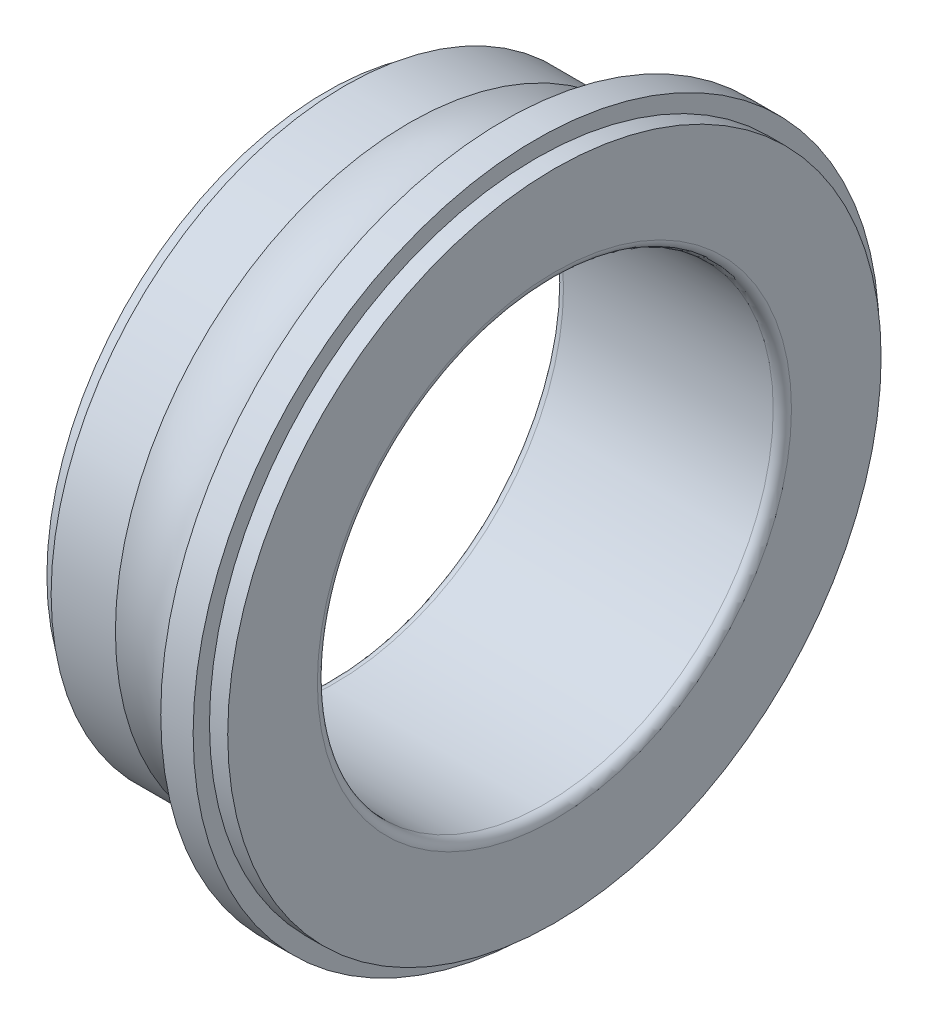
ISO-10303-21;
HEADER;
FILE_DESCRIPTION(('STEP AP214'),'2;1');
FILE_NAME('part.step','',(''),(''),'','','');
FILE_SCHEMA(('AUTOMOTIVE_DESIGN { 1 0 10303 214 1 1 1 1 }'));
ENDSEC;
DATA;
#1=APPLICATION_CONTEXT('core data for automotive mechanical design processes');
#2=APPLICATION_PROTOCOL_DEFINITION('international standard','automotive_design',2000,#1);
#3=PRODUCT_CONTEXT('',#1,'mechanical');
#4=PRODUCT('Part','Part','',(#3));
#5=PRODUCT_RELATED_PRODUCT_CATEGORY('part','',(#4));
#6=PRODUCT_DEFINITION_FORMATION('','',#4);
#7=PRODUCT_DEFINITION_CONTEXT('part definition',#1,'design');
#8=PRODUCT_DEFINITION('design','',#6,#7);
#9=PRODUCT_DEFINITION_SHAPE('','',#8);
#10=(LENGTH_UNIT() NAMED_UNIT(*) SI_UNIT(.MILLI.,.METRE.));
#11=(NAMED_UNIT(*) PLANE_ANGLE_UNIT() SI_UNIT($,.RADIAN.));
#12=(NAMED_UNIT(*) SI_UNIT($,.STERADIAN.) SOLID_ANGLE_UNIT());
#13=UNCERTAINTY_MEASURE_WITH_UNIT(LENGTH_MEASURE(1.E-05),#10,'distance_accuracy_value','');
#14=(GEOMETRIC_REPRESENTATION_CONTEXT(3) GLOBAL_UNCERTAINTY_ASSIGNED_CONTEXT((#13)) GLOBAL_UNIT_ASSIGNED_CONTEXT((#10,
#11,#12)) REPRESENTATION_CONTEXT('',''));
#15=CARTESIAN_POINT('',(0.,0.,0.));
#16=DIRECTION('',(0.,0.,1.));
#17=DIRECTION('',(1.,0.,0.));
#18=AXIS2_PLACEMENT_3D('',#15,#16,#17);
#19=CARTESIAN_POINT('',(0.,18.4,0.));
#20=DIRECTION('',(-1.,0.,0.));
#21=DIRECTION('',(0.,0.,1.));
#22=AXIS2_PLACEMENT_3D('',#19,#20,#21);
#23=PLANE('',#22);
#24=CARTESIAN_POINT('',(0.,0.,0.));
#25=DIRECTION('',(1.,0.,0.));
#26=DIRECTION('',(0.,0.,-1.));
#27=AXIS2_PLACEMENT_3D('',#24,#25,#26);
#28=CIRCLE('',#27,15.6);
#29=CARTESIAN_POINT('',(0.,0.,-15.6));
#30=VERTEX_POINT('',#29);
#31=EDGE_CURVE('E56',#30,#30,#28,.T.);
#32=ORIENTED_EDGE('',*,*,#31,.T.);
#33=EDGE_LOOP('',(#32));
#34=FACE_BOUND('',#33,.T.);
#35=CARTESIAN_POINT('',(0.,0.,0.));
#36=DIRECTION('',(1.,0.,0.));
#37=DIRECTION('',(0.,0.,-1.));
#38=AXIS2_PLACEMENT_3D('',#35,#36,#37);
#39=CIRCLE('',#38,18.4);
#40=CARTESIAN_POINT('',(0.,0.,-18.4));
#41=VERTEX_POINT('',#40);
#42=EDGE_CURVE('E53',#41,#41,#39,.T.);
#43=ORIENTED_EDGE('',*,*,#42,.F.);
#44=EDGE_LOOP('',(#43));
#45=FACE_BOUND('',#44,.T.);
#46=ADVANCED_FACE('F15',(#34,#45),#23,.T.);
#47=CARTESIAN_POINT('',(0.599999999999878,0.,0.));
#48=DIRECTION('',(1.,0.,0.));
#49=DIRECTION('',(0.,0.,-1.));
#50=AXIS2_PLACEMENT_3D('',#47,#48,#49);
#51=TOROIDAL_SURFACE('',#50,15.6,0.599999999999875);
#52=CARTESIAN_POINT('',(0.600000000000003,0.,0.));
#53=DIRECTION('',(1.,0.,0.));
#54=DIRECTION('',(0.,0.,-1.));
#55=AXIS2_PLACEMENT_3D('',#52,#53,#54);
#56=CIRCLE('',#55,15.);
#57=CARTESIAN_POINT('',(0.600000000000003,0.,-15.));
#58=VERTEX_POINT('',#57);
#59=EDGE_CURVE('E50',#58,#58,#56,.T.);
#60=ORIENTED_EDGE('',*,*,#59,.T.);
#61=EDGE_LOOP('',(#60));
#62=FACE_BOUND('',#61,.T.);
#63=ORIENTED_EDGE('',*,*,#31,.F.);
#64=EDGE_LOOP('',(#63));
#65=FACE_BOUND('',#64,.T.);
#66=ADVANCED_FACE('F62',(#62,#65),#51,.T.);
#67=CARTESIAN_POINT('',(15.,0.,0.));
#68=DIRECTION('',(1.,0.,0.));
#69=DIRECTION('',(0.,0.,-1.));
#70=AXIS2_PLACEMENT_3D('',#67,#68,#69);
#71=CYLINDRICAL_SURFACE('',#70,18.4);
#72=ORIENTED_EDGE('',*,*,#42,.T.);
#73=EDGE_LOOP('',(#72));
#74=FACE_BOUND('',#73,.T.);
#75=CARTESIAN_POINT('',(1.19999999999999,0.,0.));
#76=DIRECTION('',(1.,0.,0.));
#77=DIRECTION('',(0.,0.,-1.));
#78=AXIS2_PLACEMENT_3D('',#75,#76,#77);
#79=CIRCLE('',#78,18.4);
#80=CARTESIAN_POINT('',(1.19999999999999,0.,-18.4));
#81=VERTEX_POINT('',#80);
#82=EDGE_CURVE('E47',#81,#81,#79,.T.);
#83=ORIENTED_EDGE('',*,*,#82,.F.);
#84=EDGE_LOOP('',(#83));
#85=FACE_BOUND('',#84,.T.);
#86=ADVANCED_FACE('F64',(#74,#85),#71,.T.);
#87=CARTESIAN_POINT('',(15.,0.,0.));
#88=DIRECTION('',(1.,0.,0.));
#89=DIRECTION('',(0.,0.,-1.));
#90=AXIS2_PLACEMENT_3D('',#87,#88,#89);
#91=CYLINDRICAL_SURFACE('',#90,15.);
#92=CARTESIAN_POINT('',(14.4,0.,0.));
#93=DIRECTION('',(1.,0.,0.));
#94=DIRECTION('',(0.,0.,-1.));
#95=AXIS2_PLACEMENT_3D('',#92,#93,#94);
#96=CIRCLE('',#95,15.);
#97=CARTESIAN_POINT('',(14.4,0.,-15.));
#98=VERTEX_POINT('',#97);
#99=EDGE_CURVE('E44',#98,#98,#96,.T.);
#100=ORIENTED_EDGE('',*,*,#99,.T.);
#101=EDGE_LOOP('',(#100));
#102=FACE_BOUND('',#101,.T.);
#103=ORIENTED_EDGE('',*,*,#59,.F.);
#104=EDGE_LOOP('',(#103));
#105=FACE_BOUND('',#104,.T.);
#106=ADVANCED_FACE('F72',(#102,#105),#91,.F.);
#107=CARTESIAN_POINT('',(1.20000000000001,19.32,0.));
#108=DIRECTION('',(-1.,0.,0.));
#109=DIRECTION('',(0.,0.,1.));
#110=AXIS2_PLACEMENT_3D('',#107,#108,#109);
#111=PLANE('',#110);
#112=ORIENTED_EDGE('',*,*,#82,.T.);
#113=EDGE_LOOP('',(#112));
#114=FACE_BOUND('',#113,.T.);
#115=CARTESIAN_POINT('',(1.19999999999999,0.,0.));
#116=DIRECTION('',(1.,0.,0.));
#117=DIRECTION('',(0.,0.,-1.));
#118=AXIS2_PLACEMENT_3D('',#115,#116,#117);
#119=CIRCLE('',#118,19.32);
#120=CARTESIAN_POINT('',(1.19999999999999,0.,-19.32));
#121=VERTEX_POINT('',#120);
#122=EDGE_CURVE('E41',#121,#121,#119,.T.);
#123=ORIENTED_EDGE('',*,*,#122,.F.);
#124=EDGE_LOOP('',(#123));
#125=FACE_BOUND('',#124,.T.);
#126=ADVANCED_FACE('F79',(#114,#125),#111,.T.);
#127=CARTESIAN_POINT('',(14.4000000000002,0.,0.));
#128=DIRECTION('',(1.,0.,0.));
#129=DIRECTION('',(0.,0.,-1.));
#130=AXIS2_PLACEMENT_3D('',#127,#128,#129);
#131=TOROIDAL_SURFACE('',#130,15.5999999999997,0.59999999999975);
#132=CARTESIAN_POINT('',(15.,0.,0.));
#133=DIRECTION('',(1.,0.,0.));
#134=DIRECTION('',(0.,0.,-1.));
#135=AXIS2_PLACEMENT_3D('',#132,#133,#134);
#136=CIRCLE('',#135,15.5999999999997);
#137=CARTESIAN_POINT('',(15.,0.,-15.5999999999997));
#138=VERTEX_POINT('',#137);
#139=EDGE_CURVE('E38',#138,#138,#136,.T.);
#140=ORIENTED_EDGE('',*,*,#139,.T.);
#141=EDGE_LOOP('',(#140));
#142=FACE_BOUND('',#141,.T.);
#143=ORIENTED_EDGE('',*,*,#99,.F.);
#144=EDGE_LOOP('',(#143));
#145=FACE_BOUND('',#144,.T.);
#146=ADVANCED_FACE('F83',(#142,#145),#131,.T.);
#147=CARTESIAN_POINT('',(15.,0.,0.));
#148=DIRECTION('',(1.,0.,0.));
#149=DIRECTION('',(0.,0.,-1.));
#150=AXIS2_PLACEMENT_3D('',#147,#148,#149);
#151=CYLINDRICAL_SURFACE('',#150,19.32);
#152=ORIENTED_EDGE('',*,*,#122,.T.);
#153=EDGE_LOOP('',(#152));
#154=FACE_BOUND('',#153,.T.);
#155=CARTESIAN_POINT('',(5.42962418870389,0.,0.));
#156=DIRECTION('',(1.,0.,0.));
#157=DIRECTION('',(0.,0.,-1.));
#158=AXIS2_PLACEMENT_3D('',#155,#156,#157);
#159=CIRCLE('',#158,19.32);
#160=CARTESIAN_POINT('',(5.42962418870389,0.,-19.32));
#161=VERTEX_POINT('',#160);
#162=EDGE_CURVE('E35',#161,#161,#159,.T.);
#163=ORIENTED_EDGE('',*,*,#162,.F.);
#164=EDGE_LOOP('',(#163));
#165=FACE_BOUND('',#164,.T.);
#166=ADVANCED_FACE('F87',(#154,#165),#151,.T.);
#167=CARTESIAN_POINT('',(15.,15.6,0.));
#168=DIRECTION('',(1.,0.,0.));
#169=DIRECTION('',(0.,0.,-1.));
#170=AXIS2_PLACEMENT_3D('',#167,#168,#169);
#171=PLANE('',#170);
#172=CARTESIAN_POINT('',(15.,0.,0.));
#173=DIRECTION('',(1.,0.,0.));
#174=DIRECTION('',(0.,0.,-1.));
#175=AXIS2_PLACEMENT_3D('',#172,#173,#174);
#176=CIRCLE('',#175,21.5);
#177=CARTESIAN_POINT('',(15.,0.,-21.5));
#178=VERTEX_POINT('',#177);
#179=EDGE_CURVE('E30',#178,#178,#176,.T.);
#180=ORIENTED_EDGE('',*,*,#179,.T.);
#181=EDGE_LOOP('',(#180));
#182=FACE_BOUND('',#181,.T.);
#183=ORIENTED_EDGE('',*,*,#139,.F.);
#184=EDGE_LOOP('',(#183));
#185=FACE_BOUND('',#184,.T.);
#186=ADVANCED_FACE('F91',(#182,#185),#171,.T.);
#187=CARTESIAN_POINT('',(7.49999999999981,0.,0.));
#188=DIRECTION('',(1.,0.,0.));
#189=DIRECTION('',(0.,0.,-1.));
#190=AXIS2_PLACEMENT_3D('',#187,#188,#189);
#191=TOROIDAL_SURFACE('',#190,22.9570000000007,4.18500000000053);
#192=CARTESIAN_POINT('',(11.667529364024,0.,0.));
#193=DIRECTION('',(1.,0.,0.));
#194=DIRECTION('',(0.,0.,-1.));
#195=AXIS2_PLACEMENT_3D('',#192,#193,#194);
#196=CIRCLE('',#195,22.575);
#197=CARTESIAN_POINT('',(11.667529364024,0.,-22.575));
#198=VERTEX_POINT('',#197);
#199=EDGE_CURVE('E26',#198,#198,#196,.T.);
#200=ORIENTED_EDGE('',*,*,#199,.F.);
#201=EDGE_LOOP('',(#200));
#202=FACE_BOUND('',#201,.T.);
#203=ORIENTED_EDGE('',*,*,#162,.T.);
#204=EDGE_LOOP('',(#203));
#205=FACE_BOUND('',#204,.T.);
#206=ADVANCED_FACE('F95',(#202,#205),#191,.F.);
#207=CARTESIAN_POINT('',(15.,0.,0.));
#208=DIRECTION('',(1.,0.,0.));
#209=DIRECTION('',(0.,0.,-1.));
#210=AXIS2_PLACEMENT_3D('',#207,#208,#209);
#211=CYLINDRICAL_SURFACE('',#210,21.5);
#212=CARTESIAN_POINT('',(13.8,0.,0.));
#213=DIRECTION('',(1.,0.,0.));
#214=DIRECTION('',(0.,0.,-1.));
#215=AXIS2_PLACEMENT_3D('',#212,#213,#214);
#216=CIRCLE('',#215,21.5);
#217=CARTESIAN_POINT('',(13.8,0.,-21.5));
#218=VERTEX_POINT('',#217);
#219=EDGE_CURVE('E22',#218,#218,#216,.T.);
#220=ORIENTED_EDGE('',*,*,#219,.T.);
#221=EDGE_LOOP('',(#220));
#222=FACE_BOUND('',#221,.T.);
#223=ORIENTED_EDGE('',*,*,#179,.F.);
#224=EDGE_LOOP('',(#223));
#225=FACE_BOUND('',#224,.T.);
#226=ADVANCED_FACE('F99',(#222,#225),#211,.T.);
#227=CARTESIAN_POINT('',(15.,0.,0.));
#228=DIRECTION('',(1.,0.,0.));
#229=DIRECTION('',(0.,0.,-1.));
#230=AXIS2_PLACEMENT_3D('',#227,#228,#229);
#231=CYLINDRICAL_SURFACE('',#230,22.575);
#232=ORIENTED_EDGE('',*,*,#199,.T.);
#233=EDGE_LOOP('',(#232));
#234=FACE_BOUND('',#233,.T.);
#235=CARTESIAN_POINT('',(13.8,0.,0.));
#236=DIRECTION('',(1.,0.,0.));
#237=DIRECTION('',(0.,0.,-1.));
#238=AXIS2_PLACEMENT_3D('',#235,#236,#237);
#239=CIRCLE('',#238,22.575);
#240=CARTESIAN_POINT('',(13.8,0.,-22.575));
#241=VERTEX_POINT('',#240);
#242=EDGE_CURVE('E10',#241,#241,#239,.T.);
#243=ORIENTED_EDGE('',*,*,#242,.F.);
#244=EDGE_LOOP('',(#243));
#245=FACE_BOUND('',#244,.T.);
#246=ADVANCED_FACE('F102',(#234,#245),#231,.T.);
#247=CARTESIAN_POINT('',(13.8,21.5,0.));
#248=DIRECTION('',(1.,0.,0.));
#249=DIRECTION('',(0.,0.,-1.));
#250=AXIS2_PLACEMENT_3D('',#247,#248,#249);
#251=PLANE('',#250);
#252=ORIENTED_EDGE('',*,*,#242,.T.);
#253=EDGE_LOOP('',(#252));
#254=FACE_BOUND('',#253,.T.);
#255=ORIENTED_EDGE('',*,*,#219,.F.);
#256=EDGE_LOOP('',(#255));
#257=FACE_BOUND('',#256,.T.);
#258=ADVANCED_FACE('F17',(#254,#257),#251,.T.);
#259=CLOSED_SHELL('',(#46,#66,#86,#106,#126,#146,#166,#186,#206,#226,#246,#258));
#260=MANIFOLD_SOLID_BREP('B1',#259);
#261=ADVANCED_BREP_SHAPE_REPRESENTATION('',(#18,#260),#14);
#262=SHAPE_DEFINITION_REPRESENTATION(#9,#261);
ENDSEC;
END-ISO-10303-21;
